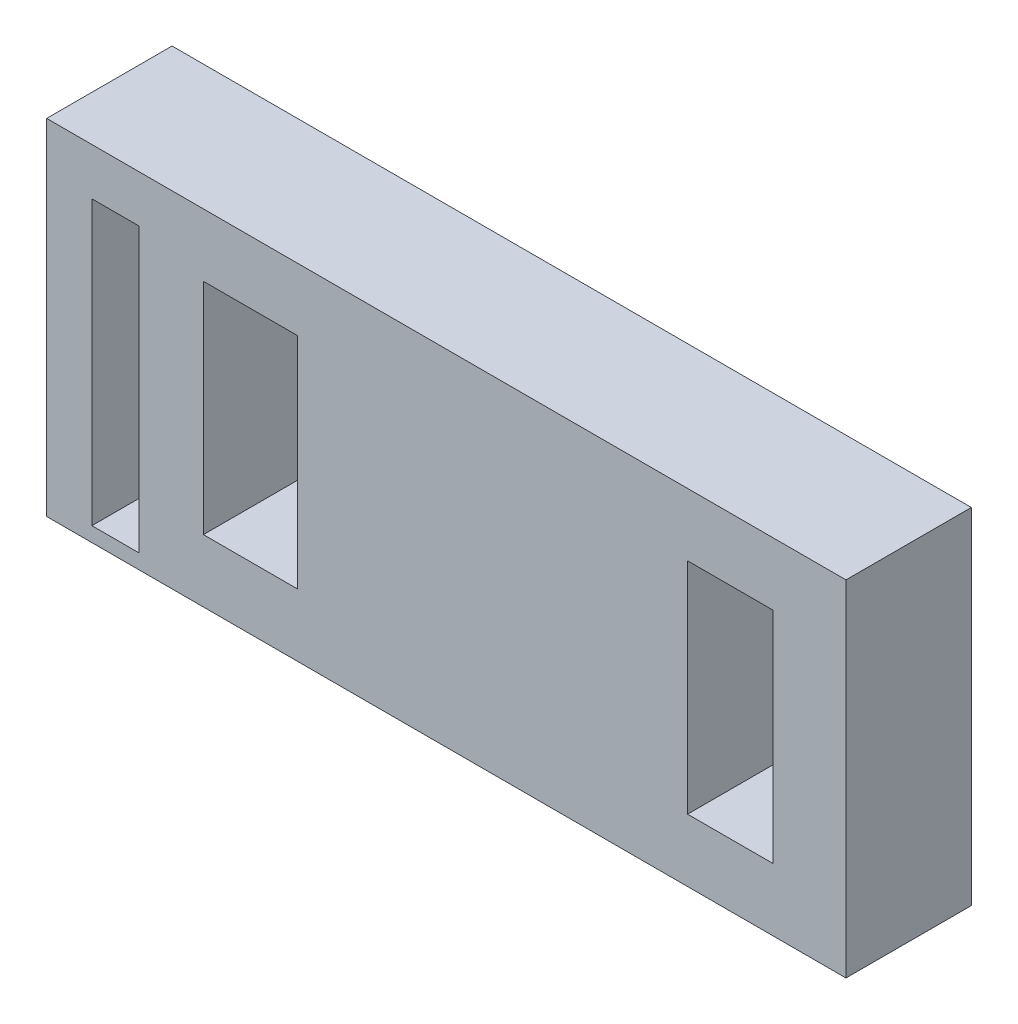
ISO-10303-21;
HEADER;
FILE_DESCRIPTION(('STEP AP214'),'2;1');
FILE_NAME('part.step','',(''),(''),'','','');
FILE_SCHEMA(('AUTOMOTIVE_DESIGN { 1 0 10303 214 1 1 1 1 }'));
ENDSEC;
DATA;
#1=APPLICATION_CONTEXT('core data for automotive mechanical design processes');
#2=APPLICATION_PROTOCOL_DEFINITION('international standard','automotive_design',2000,#1);
#3=PRODUCT_CONTEXT('',#1,'mechanical');
#4=PRODUCT('Part','Part','',(#3));
#5=PRODUCT_RELATED_PRODUCT_CATEGORY('part','',(#4));
#6=PRODUCT_DEFINITION_FORMATION('','',#4);
#7=PRODUCT_DEFINITION_CONTEXT('part definition',#1,'design');
#8=PRODUCT_DEFINITION('design','',#6,#7);
#9=PRODUCT_DEFINITION_SHAPE('','',#8);
#10=(LENGTH_UNIT() NAMED_UNIT(*) SI_UNIT(.MILLI.,.METRE.));
#11=(NAMED_UNIT(*) PLANE_ANGLE_UNIT() SI_UNIT($,.RADIAN.));
#12=(NAMED_UNIT(*) SI_UNIT($,.STERADIAN.) SOLID_ANGLE_UNIT());
#13=UNCERTAINTY_MEASURE_WITH_UNIT(LENGTH_MEASURE(1.E-05),#10,'distance_accuracy_value','');
#14=(GEOMETRIC_REPRESENTATION_CONTEXT(3) GLOBAL_UNCERTAINTY_ASSIGNED_CONTEXT((#13)) GLOBAL_UNIT_ASSIGNED_CONTEXT((#10,
#11,#12)) REPRESENTATION_CONTEXT('',''));
#15=CARTESIAN_POINT('',(0.,0.,0.));
#16=DIRECTION('',(0.,0.,1.));
#17=DIRECTION('',(1.,0.,0.));
#18=AXIS2_PLACEMENT_3D('',#15,#16,#17);
#19=CARTESIAN_POINT('',(-134.752293577982,54.9770642201835,40.));
#20=DIRECTION('',(1.,0.,0.));
#21=DIRECTION('',(0.,0.,-1.));
#22=AXIS2_PLACEMENT_3D('',#19,#20,#21);
#23=PLANE('',#22);
#24=DIRECTION('',(0.,-1.,0.));
#25=VECTOR('',#24,1.);
#26=CARTESIAN_POINT('',(-134.752293577982,54.9770642201835,0.));
#27=LINE('',#26,#25);
#28=CARTESIAN_POINT('',(-134.752293577982,54.9770642201835,0.));
#29=VERTEX_POINT('',#28);
#30=CARTESIAN_POINT('',(-134.752293577982,-55.0229357798165,0.));
#31=VERTEX_POINT('',#30);
#32=EDGE_CURVE('E281',#29,#31,#27,.T.);
#33=ORIENTED_EDGE('',*,*,#32,.T.);
#34=DIRECTION('',(0.,0.,-1.));
#35=VECTOR('',#34,1.);
#36=CARTESIAN_POINT('',(-134.752293577982,-55.0229357798165,40.));
#37=LINE('',#36,#35);
#38=CARTESIAN_POINT('',(-134.752293577982,-55.0229357798165,40.));
#39=VERTEX_POINT('',#38);
#40=EDGE_CURVE('E11',#39,#31,#37,.T.);
#41=ORIENTED_EDGE('',*,*,#40,.F.);
#42=DIRECTION('',(0.,-1.,0.));
#43=VECTOR('',#42,1.);
#44=CARTESIAN_POINT('',(-134.752293577982,54.9770642201835,40.));
#45=LINE('',#44,#43);
#46=CARTESIAN_POINT('',(-134.752293577982,54.9770642201835,40.));
#47=VERTEX_POINT('',#46);
#48=EDGE_CURVE('E291',#47,#39,#45,.T.);
#49=ORIENTED_EDGE('',*,*,#48,.F.);
#50=DIRECTION('',(0.,0.,-1.));
#51=VECTOR('',#50,1.);
#52=CARTESIAN_POINT('',(-134.752293577982,54.9770642201835,40.));
#53=LINE('',#52,#51);
#54=EDGE_CURVE('E305',#47,#29,#53,.T.);
#55=ORIENTED_EDGE('',*,*,#54,.T.);
#56=EDGE_LOOP('',(#33,#41,#49,#55));
#57=FACE_BOUND('',#56,.T.);
#58=ADVANCED_FACE('F41',(#57),#23,.F.);
#59=CARTESIAN_POINT('',(-134.752293577982,-55.0229357798165,40.));
#60=DIRECTION('',(0.,1.,0.));
#61=DIRECTION('',(0.,0.,1.));
#62=AXIS2_PLACEMENT_3D('',#59,#60,#61);
#63=PLANE('',#62);
#64=DIRECTION('',(1.,0.,0.));
#65=VECTOR('',#64,1.);
#66=CARTESIAN_POINT('',(-134.752293577982,-55.0229357798165,0.));
#67=LINE('',#66,#65);
#68=CARTESIAN_POINT('',(120.247706422018,-55.0229357798165,0.));
#69=VERTEX_POINT('',#68);
#70=EDGE_CURVE('E309',#31,#69,#67,.T.);
#71=ORIENTED_EDGE('',*,*,#70,.T.);
#72=DIRECTION('',(0.,0.,-1.));
#73=VECTOR('',#72,1.);
#74=CARTESIAN_POINT('',(120.247706422018,-55.0229357798165,40.));
#75=LINE('',#74,#73);
#76=CARTESIAN_POINT('',(120.247706422018,-55.0229357798165,40.));
#77=VERTEX_POINT('',#76);
#78=EDGE_CURVE('E49',#77,#69,#75,.T.);
#79=ORIENTED_EDGE('',*,*,#78,.F.);
#80=DIRECTION('',(1.,0.,0.));
#81=VECTOR('',#80,1.);
#82=CARTESIAN_POINT('',(-134.752293577982,-55.0229357798165,40.));
#83=LINE('',#82,#81);
#84=EDGE_CURVE('E295',#39,#77,#83,.T.);
#85=ORIENTED_EDGE('',*,*,#84,.F.);
#86=ORIENTED_EDGE('',*,*,#40,.T.);
#87=EDGE_LOOP('',(#71,#79,#85,#86));
#88=FACE_BOUND('',#87,.T.);
#89=ADVANCED_FACE('F345',(#88),#63,.F.);
#90=CARTESIAN_POINT('',(120.247706422018,54.9770642201835,40.));
#91=DIRECTION('',(-1.,0.,0.));
#92=DIRECTION('',(0.,0.,1.));
#93=AXIS2_PLACEMENT_3D('',#90,#91,#92);
#94=PLANE('',#93);
#95=DIRECTION('',(0.,1.,0.));
#96=VECTOR('',#95,1.);
#97=CARTESIAN_POINT('',(120.247706422018,54.9770642201835,0.));
#98=LINE('',#97,#96);
#99=CARTESIAN_POINT('',(120.247706422018,54.9770642201835,0.));
#100=VERTEX_POINT('',#99);
#101=EDGE_CURVE('E312',#69,#100,#98,.T.);
#102=ORIENTED_EDGE('',*,*,#101,.T.);
#103=DIRECTION('',(0.,0.,-1.));
#104=VECTOR('',#103,1.);
#105=CARTESIAN_POINT('',(120.247706422018,54.9770642201835,40.));
#106=LINE('',#105,#104);
#107=CARTESIAN_POINT('',(120.247706422018,54.9770642201835,40.));
#108=VERTEX_POINT('',#107);
#109=EDGE_CURVE('E320',#108,#100,#106,.T.);
#110=ORIENTED_EDGE('',*,*,#109,.F.);
#111=DIRECTION('',(0.,1.,0.));
#112=VECTOR('',#111,1.);
#113=CARTESIAN_POINT('',(120.247706422018,54.9770642201835,40.));
#114=LINE('',#113,#112);
#115=EDGE_CURVE('E299',#77,#108,#114,.T.);
#116=ORIENTED_EDGE('',*,*,#115,.F.);
#117=ORIENTED_EDGE('',*,*,#78,.T.);
#118=EDGE_LOOP('',(#102,#110,#116,#117));
#119=FACE_BOUND('',#118,.T.);
#120=ADVANCED_FACE('F329',(#119),#94,.F.);
#121=CARTESIAN_POINT('',(-134.752293577982,54.9770642201835,40.));
#122=DIRECTION('',(0.,-1.,0.));
#123=DIRECTION('',(0.,0.,-1.));
#124=AXIS2_PLACEMENT_3D('',#121,#122,#123);
#125=PLANE('',#124);
#126=DIRECTION('',(-1.,0.,0.));
#127=VECTOR('',#126,1.);
#128=CARTESIAN_POINT('',(-134.752293577982,54.9770642201835,0.));
#129=LINE('',#128,#127);
#130=EDGE_CURVE('E296',#100,#29,#129,.T.);
#131=ORIENTED_EDGE('',*,*,#130,.T.);
#132=ORIENTED_EDGE('',*,*,#54,.F.);
#133=DIRECTION('',(-1.,0.,0.));
#134=VECTOR('',#133,1.);
#135=CARTESIAN_POINT('',(-134.752293577982,54.9770642201835,40.));
#136=LINE('',#135,#134);
#137=EDGE_CURVE('E302',#108,#47,#136,.T.);
#138=ORIENTED_EDGE('',*,*,#137,.F.);
#139=ORIENTED_EDGE('',*,*,#109,.T.);
#140=EDGE_LOOP('',(#131,#132,#138,#139));
#141=FACE_BOUND('',#140,.T.);
#142=ADVANCED_FACE('F338',(#141),#125,.F.);
#143=CARTESIAN_POINT('',(0.,0.,40.));
#144=DIRECTION('',(0.,0.,1.));
#145=DIRECTION('',(1.,0.,0.));
#146=AXIS2_PLACEMENT_3D('',#143,#144,#145);
#147=PLANE('',#146);
#148=DIRECTION('',(0.,-1.,0.));
#149=VECTOR('',#148,1.);
#150=CARTESIAN_POINT('',(69.7166400520359,34.9770642201835,40.));
#151=LINE('',#150,#149);
#152=CARTESIAN_POINT('',(69.7166400520359,34.9770642201835,40.));
#153=VERTEX_POINT('',#152);
#154=CARTESIAN_POINT('',(69.7166400520359,-35.0229357798165,40.));
#155=VERTEX_POINT('',#154);
#156=EDGE_CURVE('E56',#153,#155,#151,.T.);
#157=ORIENTED_EDGE('',*,*,#156,.F.);
#158=DIRECTION('',(-1.,0.,0.));
#159=VECTOR('',#158,1.);
#160=CARTESIAN_POINT('',(69.7166400520359,34.9770642201835,40.));
#161=LINE('',#160,#159);
#162=CARTESIAN_POINT('',(96.9873420983163,34.9770642201835,40.));
#163=VERTEX_POINT('',#162);
#164=EDGE_CURVE('E211',#163,#153,#161,.T.);
#165=ORIENTED_EDGE('',*,*,#164,.F.);
#166=DIRECTION('',(0.,1.,0.));
#167=VECTOR('',#166,1.);
#168=CARTESIAN_POINT('',(96.9873420983163,34.9770642201835,40.));
#169=LINE('',#168,#167);
#170=CARTESIAN_POINT('',(96.9873420983163,-35.0229357798165,40.));
#171=VERTEX_POINT('',#170);
#172=EDGE_CURVE('E230',#171,#163,#169,.T.);
#173=ORIENTED_EDGE('',*,*,#172,.F.);
#174=DIRECTION('',(1.,0.,0.));
#175=VECTOR('',#174,1.);
#176=CARTESIAN_POINT('',(69.7166400520359,-35.0229357798165,40.));
#177=LINE('',#176,#175);
#178=EDGE_CURVE('E226',#155,#171,#177,.T.);
#179=ORIENTED_EDGE('',*,*,#178,.F.);
#180=EDGE_LOOP('',(#157,#165,#173,#179));
#181=FACE_BOUND('',#180,.T.);
#182=DIRECTION('',(0.,-1.,0.));
#183=VECTOR('',#182,1.);
#184=CARTESIAN_POINT('',(-120.330305265327,39.9770642201835,40.));
#185=LINE('',#184,#183);
#186=CARTESIAN_POINT('',(-120.330305265327,39.9770642201835,40.));
#187=VERTEX_POINT('',#186);
#188=CARTESIAN_POINT('',(-120.330305265327,-50.3385660078928,40.));
#189=VERTEX_POINT('',#188);
#190=EDGE_CURVE('E64',#187,#189,#185,.T.);
#191=ORIENTED_EDGE('',*,*,#190,.F.);
#192=DIRECTION('',(-1.,0.,0.));
#193=VECTOR('',#192,1.);
#194=CARTESIAN_POINT('',(-120.330305265327,39.9770642201835,40.));
#195=LINE('',#194,#193);
#196=CARTESIAN_POINT('',(-105.330305265327,39.9770642201835,40.));
#197=VERTEX_POINT('',#196);
#198=EDGE_CURVE('E177',#197,#187,#195,.T.);
#199=ORIENTED_EDGE('',*,*,#198,.F.);
#200=DIRECTION('',(0.,1.,0.));
#201=VECTOR('',#200,1.);
#202=CARTESIAN_POINT('',(-105.330305265327,39.9770642201835,40.));
#203=LINE('',#202,#201);
#204=CARTESIAN_POINT('',(-105.330305265327,-50.3385660078928,40.));
#205=VERTEX_POINT('',#204);
#206=EDGE_CURVE('E181',#205,#197,#203,.T.);
#207=ORIENTED_EDGE('',*,*,#206,.F.);
#208=DIRECTION('',(1.,0.,0.));
#209=VECTOR('',#208,1.);
#210=CARTESIAN_POINT('',(-120.330305265327,-50.3385660078928,40.));
#211=LINE('',#210,#209);
#212=EDGE_CURVE('E190',#189,#205,#211,.T.);
#213=ORIENTED_EDGE('',*,*,#212,.F.);
#214=EDGE_LOOP('',(#191,#199,#207,#213));
#215=FACE_BOUND('',#214,.T.);
#216=DIRECTION('',(0.,-1.,0.));
#217=VECTOR('',#216,1.);
#218=CARTESIAN_POINT('',(-84.7522935779817,34.9770642201835,40.));
#219=LINE('',#218,#217);
#220=CARTESIAN_POINT('',(-84.7522935779817,34.9770642201835,40.));
#221=VERTEX_POINT('',#220);
#222=CARTESIAN_POINT('',(-84.7522935779817,-35.0229357798165,40.));
#223=VERTEX_POINT('',#222);
#224=EDGE_CURVE('E200',#221,#223,#219,.T.);
#225=ORIENTED_EDGE('',*,*,#224,.F.);
#226=DIRECTION('',(-1.,0.,0.));
#227=VECTOR('',#226,1.);
#228=CARTESIAN_POINT('',(-84.7522935779817,34.9770642201835,40.));
#229=LINE('',#228,#227);
#230=CARTESIAN_POINT('',(-54.7522935779817,34.9770642201835,40.));
#231=VERTEX_POINT('',#230);
#232=EDGE_CURVE('E252',#231,#221,#229,.T.);
#233=ORIENTED_EDGE('',*,*,#232,.F.);
#234=DIRECTION('',(0.,1.,0.));
#235=VECTOR('',#234,1.);
#236=CARTESIAN_POINT('',(-54.7522935779817,34.9770642201835,40.));
#237=LINE('',#236,#235);
#238=CARTESIAN_POINT('',(-54.7522935779817,-35.0229357798165,40.));
#239=VERTEX_POINT('',#238);
#240=EDGE_CURVE('E271',#239,#231,#237,.T.);
#241=ORIENTED_EDGE('',*,*,#240,.F.);
#242=DIRECTION('',(1.,0.,0.));
#243=VECTOR('',#242,1.);
#244=CARTESIAN_POINT('',(-84.7522935779817,-35.0229357798165,40.));
#245=LINE('',#244,#243);
#246=EDGE_CURVE('E267',#223,#239,#245,.T.);
#247=ORIENTED_EDGE('',*,*,#246,.F.);
#248=EDGE_LOOP('',(#225,#233,#241,#247));
#249=FACE_BOUND('',#248,.T.);
#250=ORIENTED_EDGE('',*,*,#48,.T.);
#251=ORIENTED_EDGE('',*,*,#84,.T.);
#252=ORIENTED_EDGE('',*,*,#115,.T.);
#253=ORIENTED_EDGE('',*,*,#137,.T.);
#254=EDGE_LOOP('',(#250,#251,#252,#253));
#255=FACE_BOUND('',#254,.T.);
#256=ADVANCED_FACE('F344',(#181,#215,#249,#255),#147,.T.);
#257=CARTESIAN_POINT('',(0.,0.,0.));
#258=DIRECTION('',(0.,0.,1.));
#259=DIRECTION('',(1.,0.,0.));
#260=AXIS2_PLACEMENT_3D('',#257,#258,#259);
#261=PLANE('',#260);
#262=ORIENTED_EDGE('',*,*,#32,.F.);
#263=ORIENTED_EDGE('',*,*,#130,.F.);
#264=ORIENTED_EDGE('',*,*,#101,.F.);
#265=ORIENTED_EDGE('',*,*,#70,.F.);
#266=EDGE_LOOP('',(#262,#263,#264,#265));
#267=FACE_BOUND('',#266,.T.);
#268=ADVANCED_FACE('F335',(#267),#261,.F.);
#269=CARTESIAN_POINT('',(-84.7522935779817,34.9770642201835,10.));
#270=DIRECTION('',(-1.,0.,0.));
#271=DIRECTION('',(0.,0.,1.));
#272=AXIS2_PLACEMENT_3D('',#269,#270,#271);
#273=PLANE('',#272);
#274=ORIENTED_EDGE('',*,*,#224,.T.);
#275=DIRECTION('',(0.,0.,1.));
#276=VECTOR('',#275,1.);
#277=CARTESIAN_POINT('',(-84.7522935779817,-35.0229357798165,10.));
#278=LINE('',#277,#276);
#279=CARTESIAN_POINT('',(-84.7522935779817,-35.0229357798165,10.));
#280=VERTEX_POINT('',#279);
#281=EDGE_CURVE('E264',#280,#223,#278,.T.);
#282=ORIENTED_EDGE('',*,*,#281,.F.);
#283=DIRECTION('',(0.,-1.,0.));
#284=VECTOR('',#283,1.);
#285=CARTESIAN_POINT('',(-84.7522935779817,34.9770642201835,10.));
#286=LINE('',#285,#284);
#287=CARTESIAN_POINT('',(-84.7522935779817,34.9770642201835,10.));
#288=VERTEX_POINT('',#287);
#289=EDGE_CURVE('E247',#288,#280,#286,.T.);
#290=ORIENTED_EDGE('',*,*,#289,.F.);
#291=DIRECTION('',(0.,0.,1.));
#292=VECTOR('',#291,1.);
#293=CARTESIAN_POINT('',(-84.7522935779817,34.9770642201835,10.));
#294=LINE('',#293,#292);
#295=EDGE_CURVE('E278',#288,#221,#294,.T.);
#296=ORIENTED_EDGE('',*,*,#295,.T.);
#297=EDGE_LOOP('',(#274,#282,#290,#296));
#298=FACE_BOUND('',#297,.T.);
#299=ADVANCED_FACE('F357',(#298),#273,.F.);
#300=CARTESIAN_POINT('',(-84.7522935779817,34.9770642201835,10.));
#301=DIRECTION('',(0.,1.,0.));
#302=DIRECTION('',(-1.,0.,0.));
#303=AXIS2_PLACEMENT_3D('',#300,#301,#302);
#304=PLANE('',#303);
#305=ORIENTED_EDGE('',*,*,#232,.T.);
#306=ORIENTED_EDGE('',*,*,#295,.F.);
#307=DIRECTION('',(-1.,0.,0.));
#308=VECTOR('',#307,1.);
#309=CARTESIAN_POINT('',(-84.7522935779817,34.9770642201835,10.));
#310=LINE('',#309,#308);
#311=CARTESIAN_POINT('',(-54.7522935779817,34.9770642201835,10.));
#312=VERTEX_POINT('',#311);
#313=EDGE_CURVE('E260',#312,#288,#310,.T.);
#314=ORIENTED_EDGE('',*,*,#313,.F.);
#315=DIRECTION('',(0.,0.,1.));
#316=VECTOR('',#315,1.);
#317=CARTESIAN_POINT('',(-54.7522935779817,34.9770642201835,10.));
#318=LINE('',#317,#316);
#319=EDGE_CURVE('E282',#312,#231,#318,.T.);
#320=ORIENTED_EDGE('',*,*,#319,.T.);
#321=EDGE_LOOP('',(#305,#306,#314,#320));
#322=FACE_BOUND('',#321,.T.);
#323=ADVANCED_FACE('F363',(#322),#304,.F.);
#324=CARTESIAN_POINT('',(-54.7522935779817,34.9770642201835,10.));
#325=DIRECTION('',(1.,0.,0.));
#326=DIRECTION('',(0.,1.,0.));
#327=AXIS2_PLACEMENT_3D('',#324,#325,#326);
#328=PLANE('',#327);
#329=ORIENTED_EDGE('',*,*,#240,.T.);
#330=ORIENTED_EDGE('',*,*,#319,.F.);
#331=DIRECTION('',(0.,1.,0.));
#332=VECTOR('',#331,1.);
#333=CARTESIAN_POINT('',(-54.7522935779817,34.9770642201835,10.));
#334=LINE('',#333,#332);
#335=CARTESIAN_POINT('',(-54.7522935779817,-35.0229357798165,10.));
#336=VERTEX_POINT('',#335);
#337=EDGE_CURVE('E256',#336,#312,#334,.T.);
#338=ORIENTED_EDGE('',*,*,#337,.F.);
#339=DIRECTION('',(0.,0.,1.));
#340=VECTOR('',#339,1.);
#341=CARTESIAN_POINT('',(-54.7522935779817,-35.0229357798165,10.));
#342=LINE('',#341,#340);
#343=EDGE_CURVE('E285',#336,#239,#342,.T.);
#344=ORIENTED_EDGE('',*,*,#343,.T.);
#345=EDGE_LOOP('',(#329,#330,#338,#344));
#346=FACE_BOUND('',#345,.T.);
#347=ADVANCED_FACE('F369',(#346),#328,.F.);
#348=CARTESIAN_POINT('',(-84.7522935779817,-35.0229357798165,10.));
#349=DIRECTION('',(0.,-1.,0.));
#350=DIRECTION('',(0.,0.,-1.));
#351=AXIS2_PLACEMENT_3D('',#348,#349,#350);
#352=PLANE('',#351);
#353=ORIENTED_EDGE('',*,*,#246,.T.);
#354=ORIENTED_EDGE('',*,*,#343,.F.);
#355=DIRECTION('',(1.,0.,0.));
#356=VECTOR('',#355,1.);
#357=CARTESIAN_POINT('',(-84.7522935779817,-35.0229357798165,10.));
#358=LINE('',#357,#356);
#359=EDGE_CURVE('E251',#280,#336,#358,.T.);
#360=ORIENTED_EDGE('',*,*,#359,.F.);
#361=ORIENTED_EDGE('',*,*,#281,.T.);
#362=EDGE_LOOP('',(#353,#354,#360,#361));
#363=FACE_BOUND('',#362,.T.);
#364=ADVANCED_FACE('F365',(#363),#352,.F.);
#365=CARTESIAN_POINT('',(0.,0.,10.));
#366=DIRECTION('',(0.,0.,1.));
#367=DIRECTION('',(1.,0.,0.));
#368=AXIS2_PLACEMENT_3D('',#365,#366,#367);
#369=PLANE('',#368);
#370=ORIENTED_EDGE('',*,*,#289,.T.);
#371=ORIENTED_EDGE('',*,*,#359,.T.);
#372=ORIENTED_EDGE('',*,*,#337,.T.);
#373=ORIENTED_EDGE('',*,*,#313,.T.);
#374=EDGE_LOOP('',(#370,#371,#372,#373));
#375=FACE_BOUND('',#374,.T.);
#376=ADVANCED_FACE('F368',(#375),#369,.T.);
#377=CARTESIAN_POINT('',(-120.330305265327,39.9770642201835,10.));
#378=DIRECTION('',(-1.,0.,0.));
#379=DIRECTION('',(0.,-1.,0.));
#380=AXIS2_PLACEMENT_3D('',#377,#378,#379);
#381=PLANE('',#380);
#382=ORIENTED_EDGE('',*,*,#190,.T.);
#383=DIRECTION('',(0.,0.,1.));
#384=VECTOR('',#383,1.);
#385=CARTESIAN_POINT('',(-120.330305265327,-50.3385660078928,10.));
#386=LINE('',#385,#384);
#387=CARTESIAN_POINT('',(-120.330305265327,-50.3385660078928,10.));
#388=VERTEX_POINT('',#387);
#389=EDGE_CURVE('E152',#388,#189,#386,.T.);
#390=ORIENTED_EDGE('',*,*,#389,.F.);
#391=DIRECTION('',(0.,-1.,0.));
#392=VECTOR('',#391,1.);
#393=CARTESIAN_POINT('',(-120.330305265327,39.9770642201835,10.));
#394=LINE('',#393,#392);
#395=CARTESIAN_POINT('',(-120.330305265327,39.9770642201835,10.));
#396=VERTEX_POINT('',#395);
#397=EDGE_CURVE('E156',#396,#388,#394,.T.);
#398=ORIENTED_EDGE('',*,*,#397,.F.);
#399=DIRECTION('',(0.,0.,1.));
#400=VECTOR('',#399,1.);
#401=CARTESIAN_POINT('',(-120.330305265327,39.9770642201835,10.));
#402=LINE('',#401,#400);
#403=EDGE_CURVE('E197',#396,#187,#402,.T.);
#404=ORIENTED_EDGE('',*,*,#403,.T.);
#405=EDGE_LOOP('',(#382,#390,#398,#404));
#406=FACE_BOUND('',#405,.T.);
#407=ADVANCED_FACE('F154',(#406),#381,.F.);
#408=CARTESIAN_POINT('',(-120.330305265327,39.9770642201835,10.));
#409=DIRECTION('',(0.,1.,0.));
#410=DIRECTION('',(0.,0.,1.));
#411=AXIS2_PLACEMENT_3D('',#408,#409,#410);
#412=PLANE('',#411);
#413=ORIENTED_EDGE('',*,*,#198,.T.);
#414=ORIENTED_EDGE('',*,*,#403,.F.);
#415=DIRECTION('',(-1.,0.,0.));
#416=VECTOR('',#415,1.);
#417=CARTESIAN_POINT('',(-120.330305265327,39.9770642201835,10.));
#418=LINE('',#417,#416);
#419=CARTESIAN_POINT('',(-105.330305265327,39.9770642201835,10.));
#420=VERTEX_POINT('',#419);
#421=EDGE_CURVE('E163',#420,#396,#418,.T.);
#422=ORIENTED_EDGE('',*,*,#421,.F.);
#423=DIRECTION('',(0.,0.,1.));
#424=VECTOR('',#423,1.);
#425=CARTESIAN_POINT('',(-105.330305265327,39.9770642201835,10.));
#426=LINE('',#425,#424);
#427=EDGE_CURVE('E201',#420,#197,#426,.T.);
#428=ORIENTED_EDGE('',*,*,#427,.T.);
#429=EDGE_LOOP('',(#413,#414,#422,#428));
#430=FACE_BOUND('',#429,.T.);
#431=ADVANCED_FACE('F401',(#430),#412,.F.);
#432=CARTESIAN_POINT('',(-105.330305265327,39.9770642201835,10.));
#433=DIRECTION('',(1.,0.,0.));
#434=DIRECTION('',(0.,1.,0.));
#435=AXIS2_PLACEMENT_3D('',#432,#433,#434);
#436=PLANE('',#435);
#437=ORIENTED_EDGE('',*,*,#206,.T.);
#438=ORIENTED_EDGE('',*,*,#427,.F.);
#439=DIRECTION('',(0.,1.,0.));
#440=VECTOR('',#439,1.);
#441=CARTESIAN_POINT('',(-105.330305265327,39.9770642201835,10.));
#442=LINE('',#441,#440);
#443=CARTESIAN_POINT('',(-105.330305265327,-50.3385660078928,10.));
#444=VERTEX_POINT('',#443);
#445=EDGE_CURVE('E172',#444,#420,#442,.T.);
#446=ORIENTED_EDGE('',*,*,#445,.F.);
#447=DIRECTION('',(0.,0.,1.));
#448=VECTOR('',#447,1.);
#449=CARTESIAN_POINT('',(-105.330305265327,-50.3385660078928,10.));
#450=LINE('',#449,#448);
#451=EDGE_CURVE('E162',#444,#205,#450,.T.);
#452=ORIENTED_EDGE('',*,*,#451,.T.);
#453=EDGE_LOOP('',(#437,#438,#446,#452));
#454=FACE_BOUND('',#453,.T.);
#455=ADVANCED_FACE('F404',(#454),#436,.F.);
#456=CARTESIAN_POINT('',(-120.330305265327,-50.3385660078928,10.));
#457=DIRECTION('',(0.,-1.,0.));
#458=DIRECTION('',(0.,0.,-1.));
#459=AXIS2_PLACEMENT_3D('',#456,#457,#458);
#460=PLANE('',#459);
#461=ORIENTED_EDGE('',*,*,#212,.T.);
#462=ORIENTED_EDGE('',*,*,#451,.F.);
#463=DIRECTION('',(1.,0.,0.));
#464=VECTOR('',#463,1.);
#465=CARTESIAN_POINT('',(-120.330305265327,-50.3385660078928,10.));
#466=LINE('',#465,#464);
#467=EDGE_CURVE('E166',#388,#444,#466,.T.);
#468=ORIENTED_EDGE('',*,*,#467,.F.);
#469=ORIENTED_EDGE('',*,*,#389,.T.);
#470=EDGE_LOOP('',(#461,#462,#468,#469));
#471=FACE_BOUND('',#470,.T.);
#472=ADVANCED_FACE('F167',(#471),#460,.F.);
#473=CARTESIAN_POINT('',(0.,0.,10.));
#474=DIRECTION('',(0.,0.,1.));
#475=DIRECTION('',(1.,0.,0.));
#476=AXIS2_PLACEMENT_3D('',#473,#474,#475);
#477=PLANE('',#476);
#478=ORIENTED_EDGE('',*,*,#397,.T.);
#479=ORIENTED_EDGE('',*,*,#467,.T.);
#480=ORIENTED_EDGE('',*,*,#445,.T.);
#481=ORIENTED_EDGE('',*,*,#421,.T.);
#482=EDGE_LOOP('',(#478,#479,#480,#481));
#483=FACE_BOUND('',#482,.T.);
#484=ADVANCED_FACE('F174',(#483),#477,.T.);
#485=CARTESIAN_POINT('',(69.7166400520359,34.9770642201835,10.));
#486=DIRECTION('',(-1.,0.,0.));
#487=DIRECTION('',(0.,0.,1.));
#488=AXIS2_PLACEMENT_3D('',#485,#486,#487);
#489=PLANE('',#488);
#490=ORIENTED_EDGE('',*,*,#156,.T.);
#491=DIRECTION('',(0.,0.,1.));
#492=VECTOR('',#491,1.);
#493=CARTESIAN_POINT('',(69.7166400520359,-35.0229357798165,10.));
#494=LINE('',#493,#492);
#495=CARTESIAN_POINT('',(69.7166400520359,-35.0229357798165,10.));
#496=VERTEX_POINT('',#495);
#497=EDGE_CURVE('E223',#496,#155,#494,.T.);
#498=ORIENTED_EDGE('',*,*,#497,.F.);
#499=DIRECTION('',(0.,-1.,0.));
#500=VECTOR('',#499,1.);
#501=CARTESIAN_POINT('',(69.7166400520359,34.9770642201835,10.));
#502=LINE('',#501,#500);
#503=CARTESIAN_POINT('',(69.7166400520359,34.9770642201835,10.));
#504=VERTEX_POINT('',#503);
#505=EDGE_CURVE('E206',#504,#496,#502,.T.);
#506=ORIENTED_EDGE('',*,*,#505,.F.);
#507=DIRECTION('',(0.,0.,1.));
#508=VECTOR('',#507,1.);
#509=CARTESIAN_POINT('',(69.7166400520359,34.9770642201835,10.));
#510=LINE('',#509,#508);
#511=EDGE_CURVE('E191',#504,#153,#510,.T.);
#512=ORIENTED_EDGE('',*,*,#511,.T.);
#513=EDGE_LOOP('',(#490,#498,#506,#512));
#514=FACE_BOUND('',#513,.T.);
#515=ADVANCED_FACE('F380',(#514),#489,.F.);
#516=CARTESIAN_POINT('',(69.7166400520359,34.9770642201835,10.));
#517=DIRECTION('',(0.,1.,0.));
#518=DIRECTION('',(0.,0.,1.));
#519=AXIS2_PLACEMENT_3D('',#516,#517,#518);
#520=PLANE('',#519);
#521=ORIENTED_EDGE('',*,*,#164,.T.);
#522=ORIENTED_EDGE('',*,*,#511,.F.);
#523=DIRECTION('',(-1.,0.,0.));
#524=VECTOR('',#523,1.);
#525=CARTESIAN_POINT('',(69.7166400520359,34.9770642201835,10.));
#526=LINE('',#525,#524);
#527=CARTESIAN_POINT('',(96.9873420983163,34.9770642201835,10.));
#528=VERTEX_POINT('',#527);
#529=EDGE_CURVE('E219',#528,#504,#526,.T.);
#530=ORIENTED_EDGE('',*,*,#529,.F.);
#531=DIRECTION('',(0.,0.,1.));
#532=VECTOR('',#531,1.);
#533=CARTESIAN_POINT('',(96.9873420983163,34.9770642201835,10.));
#534=LINE('',#533,#532);
#535=EDGE_CURVE('E239',#528,#163,#534,.T.);
#536=ORIENTED_EDGE('',*,*,#535,.T.);
#537=EDGE_LOOP('',(#521,#522,#530,#536));
#538=FACE_BOUND('',#537,.T.);
#539=ADVANCED_FACE('F383',(#538),#520,.F.);
#540=CARTESIAN_POINT('',(96.9873420983163,34.9770642201835,10.));
#541=DIRECTION('',(1.,0.,0.));
#542=DIRECTION('',(0.,0.,-1.));
#543=AXIS2_PLACEMENT_3D('',#540,#541,#542);
#544=PLANE('',#543);
#545=ORIENTED_EDGE('',*,*,#172,.T.);
#546=ORIENTED_EDGE('',*,*,#535,.F.);
#547=DIRECTION('',(0.,1.,0.));
#548=VECTOR('',#547,1.);
#549=CARTESIAN_POINT('',(96.9873420983163,34.9770642201835,10.));
#550=LINE('',#549,#548);
#551=CARTESIAN_POINT('',(96.9873420983163,-35.0229357798165,10.));
#552=VERTEX_POINT('',#551);
#553=EDGE_CURVE('E215',#552,#528,#550,.T.);
#554=ORIENTED_EDGE('',*,*,#553,.F.);
#555=DIRECTION('',(0.,0.,1.));
#556=VECTOR('',#555,1.);
#557=CARTESIAN_POINT('',(96.9873420983163,-35.0229357798165,10.));
#558=LINE('',#557,#556);
#559=EDGE_CURVE('E242',#552,#171,#558,.T.);
#560=ORIENTED_EDGE('',*,*,#559,.T.);
#561=EDGE_LOOP('',(#545,#546,#554,#560));
#562=FACE_BOUND('',#561,.T.);
#563=ADVANCED_FACE('F388',(#562),#544,.F.);
#564=CARTESIAN_POINT('',(69.7166400520359,-35.0229357798165,10.));
#565=DIRECTION('',(0.,-1.,0.));
#566=DIRECTION('',(0.,0.,-1.));
#567=AXIS2_PLACEMENT_3D('',#564,#565,#566);
#568=PLANE('',#567);
#569=ORIENTED_EDGE('',*,*,#178,.T.);
#570=ORIENTED_EDGE('',*,*,#559,.F.);
#571=DIRECTION('',(1.,0.,0.));
#572=VECTOR('',#571,1.);
#573=CARTESIAN_POINT('',(69.7166400520359,-35.0229357798165,10.));
#574=LINE('',#573,#572);
#575=EDGE_CURVE('E210',#496,#552,#574,.T.);
#576=ORIENTED_EDGE('',*,*,#575,.F.);
#577=ORIENTED_EDGE('',*,*,#497,.T.);
#578=EDGE_LOOP('',(#569,#570,#576,#577));
#579=FACE_BOUND('',#578,.T.);
#580=ADVANCED_FACE('F384',(#579),#568,.F.);
#581=CARTESIAN_POINT('',(0.,0.,10.));
#582=DIRECTION('',(0.,0.,1.));
#583=DIRECTION('',(1.,0.,0.));
#584=AXIS2_PLACEMENT_3D('',#581,#582,#583);
#585=PLANE('',#584);
#586=ORIENTED_EDGE('',*,*,#505,.T.);
#587=ORIENTED_EDGE('',*,*,#575,.T.);
#588=ORIENTED_EDGE('',*,*,#553,.T.);
#589=ORIENTED_EDGE('',*,*,#529,.T.);
#590=EDGE_LOOP('',(#586,#587,#588,#589));
#591=FACE_BOUND('',#590,.T.);
#592=ADVANCED_FACE('F387',(#591),#585,.T.);
#593=CLOSED_SHELL('',(#58,#89,#120,#142,#256,#268,#299,#323,#347,#364,#376,#407,#431,#455,#472,
#484,#515,#539,#563,#580,#592));
#594=MANIFOLD_SOLID_BREP('B2',#593);
#595=ADVANCED_BREP_SHAPE_REPRESENTATION('',(#18,#594),#14);
#596=SHAPE_DEFINITION_REPRESENTATION(#9,#595);
ENDSEC;
END-ISO-10303-21;
